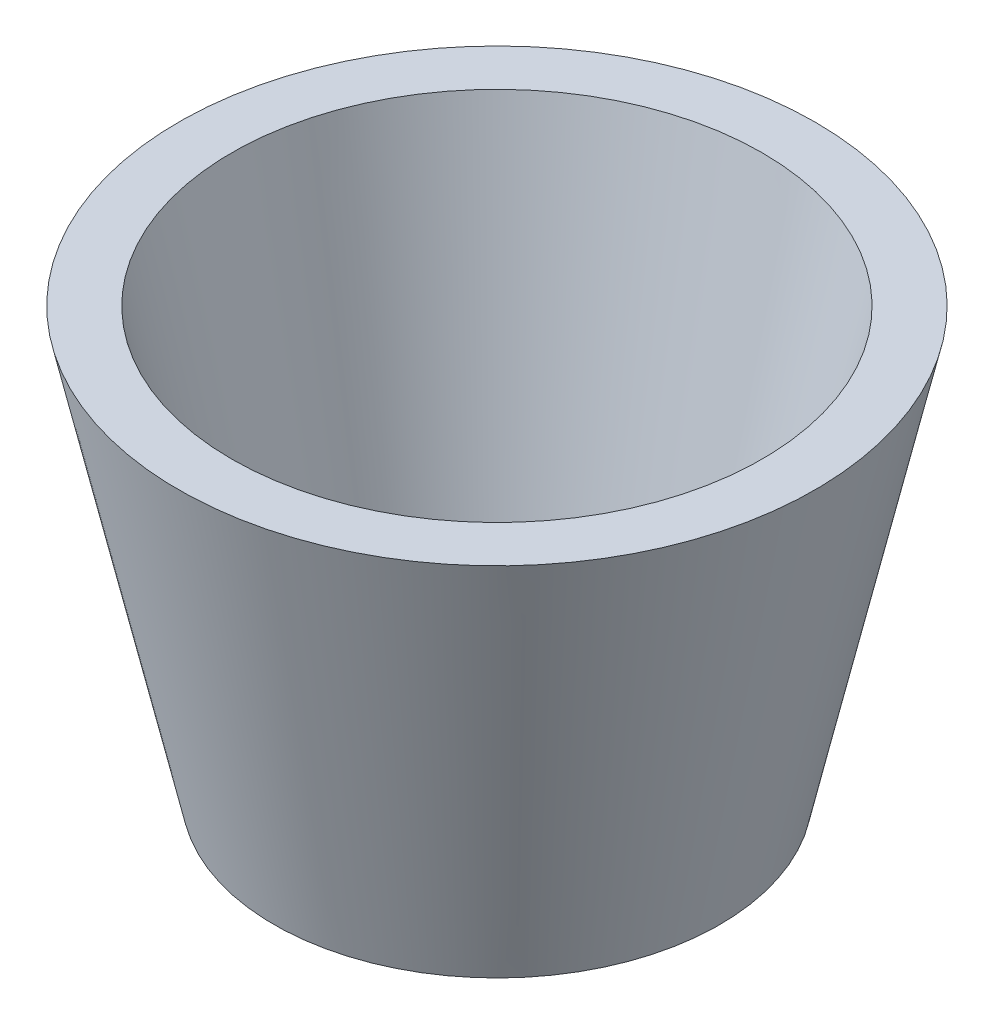
ISO-10303-21;
HEADER;
FILE_DESCRIPTION(('STEP AP214'),'2;1');
FILE_NAME('part.step','',(''),(''),'','','');
FILE_SCHEMA(('AUTOMOTIVE_DESIGN { 1 0 10303 214 1 1 1 1 }'));
ENDSEC;
DATA;
#1=APPLICATION_CONTEXT('core data for automotive mechanical design processes');
#2=APPLICATION_PROTOCOL_DEFINITION('international standard','automotive_design',2000,#1);
#3=PRODUCT_CONTEXT('',#1,'mechanical');
#4=PRODUCT('Part','Part','',(#3));
#5=PRODUCT_RELATED_PRODUCT_CATEGORY('part','',(#4));
#6=PRODUCT_DEFINITION_FORMATION('','',#4);
#7=PRODUCT_DEFINITION_CONTEXT('part definition',#1,'design');
#8=PRODUCT_DEFINITION('design','',#6,#7);
#9=PRODUCT_DEFINITION_SHAPE('','',#8);
#10=(LENGTH_UNIT() NAMED_UNIT(*) SI_UNIT(.MILLI.,.METRE.));
#11=(NAMED_UNIT(*) PLANE_ANGLE_UNIT() SI_UNIT($,.RADIAN.));
#12=(NAMED_UNIT(*) SI_UNIT($,.STERADIAN.) SOLID_ANGLE_UNIT());
#13=UNCERTAINTY_MEASURE_WITH_UNIT(LENGTH_MEASURE(1.E-05),#10,'distance_accuracy_value','');
#14=(GEOMETRIC_REPRESENTATION_CONTEXT(3) GLOBAL_UNCERTAINTY_ASSIGNED_CONTEXT((#13)) GLOBAL_UNIT_ASSIGNED_CONTEXT((#10,
#11,#12)) REPRESENTATION_CONTEXT('',''));
#15=CARTESIAN_POINT('',(0.,0.,0.));
#16=DIRECTION('',(0.,0.,1.));
#17=DIRECTION('',(1.,0.,0.));
#18=AXIS2_PLACEMENT_3D('',#15,#16,#17);
#19=CARTESIAN_POINT('',(0.,0.,0.));
#20=DIRECTION('',(0.,-1.,0.));
#21=DIRECTION('',(0.,0.,-1.));
#22=AXIS2_PLACEMENT_3D('',#19,#20,#21);
#23=CYLINDRICAL_SURFACE('',#22,6.);
#24=CARTESIAN_POINT('',(0.,0.,0.));
#25=DIRECTION('',(0.,-1.,0.));
#26=DIRECTION('',(0.,0.,-1.));
#27=AXIS2_PLACEMENT_3D('',#24,#25,#26);
#28=CIRCLE('',#27,6.);
#29=CARTESIAN_POINT('',(0.,0.,-6.));
#30=VERTEX_POINT('',#29);
#31=EDGE_CURVE('E10',#30,#30,#28,.T.);
#32=ORIENTED_EDGE('',*,*,#31,.T.);
#33=EDGE_LOOP('',(#32));
#34=FACE_BOUND('',#33,.T.);
#35=CARTESIAN_POINT('',(0.,10.,0.));
#36=DIRECTION('',(0.,-1.,0.));
#37=DIRECTION('',(0.,0.,-1.));
#38=AXIS2_PLACEMENT_3D('',#35,#36,#37);
#39=CIRCLE('',#38,6.);
#40=CARTESIAN_POINT('',(0.,10.,-6.));
#41=VERTEX_POINT('',#40);
#42=EDGE_CURVE('E48',#41,#41,#39,.T.);
#43=ORIENTED_EDGE('',*,*,#42,.F.);
#44=EDGE_LOOP('',(#43));
#45=FACE_BOUND('',#44,.T.);
#46=ADVANCED_FACE('F41',(#34,#45),#23,.F.);
#47=CARTESIAN_POINT('',(34.25,10.,0.));
#48=DIRECTION('',(0.,1.,0.));
#49=DIRECTION('',(0.,0.,1.));
#50=AXIS2_PLACEMENT_3D('',#47,#48,#49);
#51=PLANE('',#50);
#52=ORIENTED_EDGE('',*,*,#42,.T.);
#53=EDGE_LOOP('',(#52));
#54=FACE_BOUND('',#53,.T.);
#55=CARTESIAN_POINT('',(0.,10.,0.));
#56=DIRECTION('',(0.,-1.,0.));
#57=DIRECTION('',(0.,0.,-1.));
#58=AXIS2_PLACEMENT_3D('',#55,#56,#57);
#59=CIRCLE('',#58,34.25);
#60=CARTESIAN_POINT('',(0.,10.,-34.25));
#61=VERTEX_POINT('',#60);
#62=EDGE_CURVE('E53',#61,#61,#59,.T.);
#63=ORIENTED_EDGE('',*,*,#62,.F.);
#64=EDGE_LOOP('',(#63));
#65=FACE_BOUND('',#64,.T.);
#66=ADVANCED_FACE('F90',(#54,#65),#51,.T.);
#67=CARTESIAN_POINT('',(0.,80.,0.));
#68=DIRECTION('',(0.,1.,0.));
#69=DIRECTION('',(0.,0.,1.));
#70=AXIS2_PLACEMENT_3D('',#67,#68,#69);
#71=CONICAL_SURFACE('',#70,50.,0.221314442347791);
#72=ORIENTED_EDGE('',*,*,#62,.T.);
#73=EDGE_LOOP('',(#72));
#74=FACE_BOUND('',#73,.T.);
#75=CARTESIAN_POINT('',(0.,80.,0.));
#76=DIRECTION('',(0.,-1.,0.));
#77=DIRECTION('',(0.,0.,-1.));
#78=AXIS2_PLACEMENT_3D('',#75,#76,#77);
#79=CIRCLE('',#78,50.);
#80=CARTESIAN_POINT('',(0.,80.,-50.));
#81=VERTEX_POINT('',#80);
#82=EDGE_CURVE('E58',#81,#81,#79,.T.);
#83=ORIENTED_EDGE('',*,*,#82,.F.);
#84=EDGE_LOOP('',(#83));
#85=FACE_BOUND('',#84,.T.);
#86=ADVANCED_FACE('F86',(#74,#85),#71,.F.);
#87=CARTESIAN_POINT('',(60.,80.,0.));
#88=DIRECTION('',(0.,1.,0.));
#89=DIRECTION('',(0.,0.,1.));
#90=AXIS2_PLACEMENT_3D('',#87,#88,#89);
#91=PLANE('',#90);
#92=ORIENTED_EDGE('',*,*,#82,.T.);
#93=EDGE_LOOP('',(#92));
#94=FACE_BOUND('',#93,.T.);
#95=CARTESIAN_POINT('',(0.,80.,0.));
#96=DIRECTION('',(0.,-1.,0.));
#97=DIRECTION('',(0.,0.,-1.));
#98=AXIS2_PLACEMENT_3D('',#95,#96,#97);
#99=CIRCLE('',#98,60.);
#100=CARTESIAN_POINT('',(0.,80.,-60.));
#101=VERTEX_POINT('',#100);
#102=EDGE_CURVE('E64',#101,#101,#99,.T.);
#103=ORIENTED_EDGE('',*,*,#102,.F.);
#104=EDGE_LOOP('',(#103));
#105=FACE_BOUND('',#104,.T.);
#106=ADVANCED_FACE('F78',(#94,#105),#91,.T.);
#107=CARTESIAN_POINT('',(0.,0.,0.));
#108=DIRECTION('',(0.,1.,0.));
#109=DIRECTION('',(0.,0.,1.));
#110=AXIS2_PLACEMENT_3D('',#107,#108,#109);
#111=CONICAL_SURFACE('',#110,42.,0.221314442347791);
#112=ORIENTED_EDGE('',*,*,#102,.T.);
#113=EDGE_LOOP('',(#112));
#114=FACE_BOUND('',#113,.T.);
#115=CARTESIAN_POINT('',(0.,0.,0.));
#116=DIRECTION('',(0.,-1.,0.));
#117=DIRECTION('',(0.,0.,-1.));
#118=AXIS2_PLACEMENT_3D('',#115,#116,#117);
#119=CIRCLE('',#118,42.);
#120=CARTESIAN_POINT('',(0.,0.,-42.));
#121=VERTEX_POINT('',#120);
#122=EDGE_CURVE('E68',#121,#121,#119,.T.);
#123=ORIENTED_EDGE('',*,*,#122,.F.);
#124=EDGE_LOOP('',(#123));
#125=FACE_BOUND('',#124,.T.);
#126=ADVANCED_FACE('F76',(#114,#125),#111,.T.);
#127=CARTESIAN_POINT('',(20.,0.,0.));
#128=DIRECTION('',(0.,-1.,0.));
#129=DIRECTION('',(0.,0.,-1.));
#130=AXIS2_PLACEMENT_3D('',#127,#128,#129);
#131=PLANE('',#130);
#132=ORIENTED_EDGE('',*,*,#122,.T.);
#133=EDGE_LOOP('',(#132));
#134=FACE_BOUND('',#133,.T.);
#135=ORIENTED_EDGE('',*,*,#31,.F.);
#136=EDGE_LOOP('',(#135));
#137=FACE_BOUND('',#136,.T.);
#138=ADVANCED_FACE('F73',(#134,#137),#131,.T.);
#139=CLOSED_SHELL('',(#46,#66,#86,#106,#126,#138));
#140=MANIFOLD_SOLID_BREP('B2',#139);
#141=ADVANCED_BREP_SHAPE_REPRESENTATION('',(#18,#140),#14);
#142=SHAPE_DEFINITION_REPRESENTATION(#9,#141);
ENDSEC;
END-ISO-10303-21;
